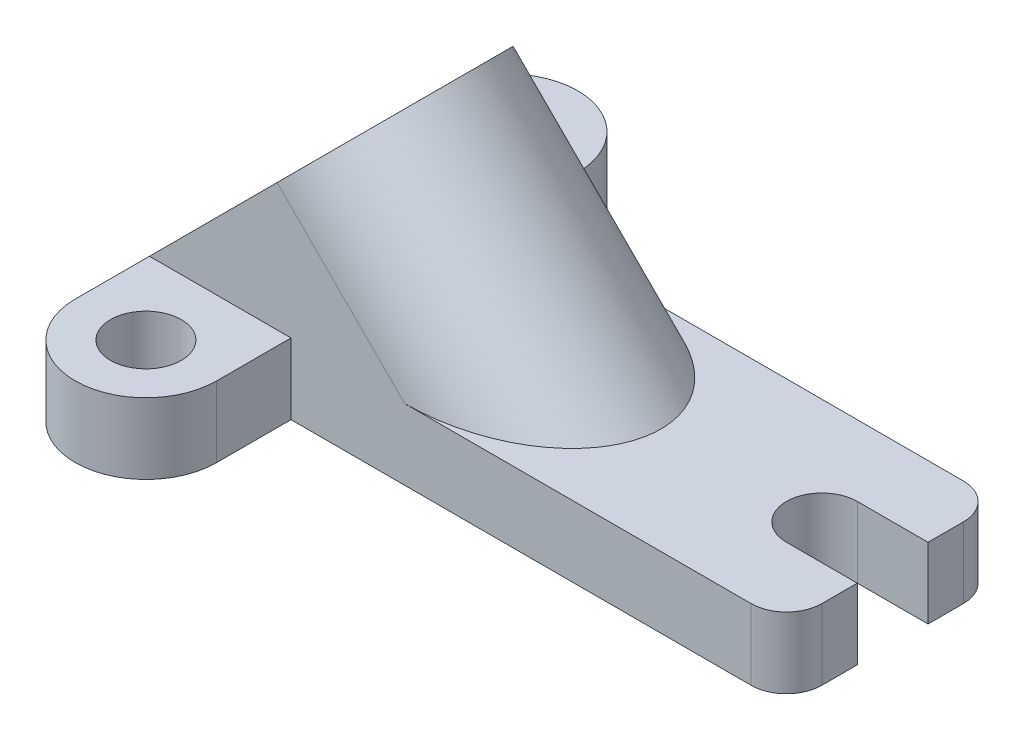
ISO-10303-21;
HEADER;
FILE_DESCRIPTION(('STEP AP214'),'2;1');
FILE_NAME('part.step','',(''),(''),'','','');
FILE_SCHEMA(('AUTOMOTIVE_DESIGN { 1 0 10303 214 1 1 1 1 }'));
ENDSEC;
DATA;
#1=APPLICATION_CONTEXT('core data for automotive mechanical design processes');
#2=APPLICATION_PROTOCOL_DEFINITION('international standard','automotive_design',2000,#1);
#3=PRODUCT_CONTEXT('',#1,'mechanical');
#4=PRODUCT('Part','Part','',(#3));
#5=PRODUCT_RELATED_PRODUCT_CATEGORY('part','',(#4));
#6=PRODUCT_DEFINITION_FORMATION('','',#4);
#7=PRODUCT_DEFINITION_CONTEXT('part definition',#1,'design');
#8=PRODUCT_DEFINITION('design','',#6,#7);
#9=PRODUCT_DEFINITION_SHAPE('','',#8);
#10=(LENGTH_UNIT() NAMED_UNIT(*) SI_UNIT(.MILLI.,.METRE.));
#11=(NAMED_UNIT(*) PLANE_ANGLE_UNIT() SI_UNIT($,.RADIAN.));
#12=(NAMED_UNIT(*) SI_UNIT($,.STERADIAN.) SOLID_ANGLE_UNIT());
#13=UNCERTAINTY_MEASURE_WITH_UNIT(LENGTH_MEASURE(1.E-05),#10,'distance_accuracy_value','');
#14=(GEOMETRIC_REPRESENTATION_CONTEXT(3) GLOBAL_UNCERTAINTY_ASSIGNED_CONTEXT((#13)) GLOBAL_UNIT_ASSIGNED_CONTEXT((#10,
#11,#12)) REPRESENTATION_CONTEXT('',''));
#15=CARTESIAN_POINT('',(0.,0.,0.));
#16=DIRECTION('',(0.,0.,1.));
#17=DIRECTION('',(1.,0.,0.));
#18=AXIS2_PLACEMENT_3D('',#15,#16,#17);
#19=CARTESIAN_POINT('',(20.,20.,51.));
#20=DIRECTION('',(0.,1.,0.));
#21=DIRECTION('',(0.,0.,1.));
#22=AXIS2_PLACEMENT_3D('',#19,#20,#21);
#23=PLANE('',#22);
#24=CARTESIAN_POINT('',(20.,20.,51.));
#25=DIRECTION('',(0.,1.,0.));
#26=DIRECTION('',(0.,0.,1.));
#27=AXIS2_PLACEMENT_3D('',#24,#25,#26);
#28=CIRCLE('',#27,10.);
#29=CARTESIAN_POINT('',(20.,20.,61.));
#30=VERTEX_POINT('',#29);
#31=EDGE_CURVE('E184',#30,#30,#28,.T.);
#32=ORIENTED_EDGE('',*,*,#31,.F.);
#33=EDGE_LOOP('',(#32));
#34=FACE_BOUND('',#33,.T.);
#35=DIRECTION('',(0.,0.,-1.));
#36=VECTOR('',#35,1.);
#37=CARTESIAN_POINT('',(40.,20.,51.));
#38=LINE('',#37,#36);
#39=CARTESIAN_POINT('',(40.,20.,51.));
#40=VERTEX_POINT('',#39);
#41=CARTESIAN_POINT('',(40.,20.,30.));
#42=VERTEX_POINT('',#41);
#43=EDGE_CURVE('E118',#40,#42,#38,.T.);
#44=ORIENTED_EDGE('',*,*,#43,.T.);
#45=DIRECTION('',(-1.,0.,0.));
#46=VECTOR('',#45,1.);
#47=CARTESIAN_POINT('',(150.739976439355,20.,30.));
#48=LINE('',#47,#46);
#49=CARTESIAN_POINT('',(0.,20.,30.));
#50=VERTEX_POINT('',#49);
#51=EDGE_CURVE('E11',#42,#50,#48,.T.);
#52=ORIENTED_EDGE('',*,*,#51,.T.);
#53=DIRECTION('',(0.,0.,1.));
#54=VECTOR('',#53,1.);
#55=CARTESIAN_POINT('',(0.,20.,-51.));
#56=LINE('',#55,#54);
#57=CARTESIAN_POINT('',(0.,20.,51.));
#58=VERTEX_POINT('',#57);
#59=EDGE_CURVE('E57',#50,#58,#56,.T.);
#60=ORIENTED_EDGE('',*,*,#59,.T.);
#61=CARTESIAN_POINT('',(20.,20.,51.));
#62=DIRECTION('',(0.,1.,0.));
#63=DIRECTION('',(0.,0.,1.));
#64=AXIS2_PLACEMENT_3D('',#61,#62,#63);
#65=CIRCLE('',#64,20.);
#66=EDGE_CURVE('E208',#58,#40,#65,.T.);
#67=ORIENTED_EDGE('',*,*,#66,.T.);
#68=EDGE_LOOP('',(#44,#52,#60,#67));
#69=FACE_BOUND('',#68,.T.);
#70=ADVANCED_FACE('F33',(#34,#69),#23,.T.);
#71=CARTESIAN_POINT('',(20.,20.,-51.));
#72=DIRECTION('',(0.,1.,0.));
#73=DIRECTION('',(0.,0.,-1.));
#74=AXIS2_PLACEMENT_3D('',#71,#72,#73);
#75=CIRCLE('',#74,10.);
#76=CARTESIAN_POINT('',(20.,20.,-61.));
#77=VERTEX_POINT('',#76);
#78=EDGE_CURVE('E315',#77,#77,#75,.T.);
#79=ORIENTED_EDGE('',*,*,#78,.F.);
#80=EDGE_LOOP('',(#79));
#81=FACE_BOUND('',#80,.T.);
#82=CARTESIAN_POINT('',(0.,20.,-51.));
#83=VERTEX_POINT('',#82);
#84=CARTESIAN_POINT('',(0.,20.,-30.));
#85=VERTEX_POINT('',#84);
#86=EDGE_CURVE('E175',#83,#85,#56,.T.);
#87=ORIENTED_EDGE('',*,*,#86,.T.);
#88=DIRECTION('',(1.,0.,0.));
#89=VECTOR('',#88,1.);
#90=CARTESIAN_POINT('',(114.677530598841,20.,-30.));
#91=LINE('',#90,#89);
#92=CARTESIAN_POINT('',(40.,20.,-30.));
#93=VERTEX_POINT('',#92);
#94=EDGE_CURVE('E156',#85,#93,#91,.T.);
#95=ORIENTED_EDGE('',*,*,#94,.T.);
#96=DIRECTION('',(0.,0.,-1.));
#97=VECTOR('',#96,1.);
#98=CARTESIAN_POINT('',(40.,20.,-51.));
#99=LINE('',#98,#97);
#100=CARTESIAN_POINT('',(40.,20.,-51.));
#101=VERTEX_POINT('',#100);
#102=EDGE_CURVE('E148',#93,#101,#99,.T.);
#103=ORIENTED_EDGE('',*,*,#102,.T.);
#104=CARTESIAN_POINT('',(20.,20.,-51.));
#105=DIRECTION('',(0.,1.,0.));
#106=DIRECTION('',(0.,0.,-1.));
#107=AXIS2_PLACEMENT_3D('',#104,#105,#106);
#108=CIRCLE('',#107,20.);
#109=EDGE_CURVE('E153',#101,#83,#108,.T.);
#110=ORIENTED_EDGE('',*,*,#109,.T.);
#111=EDGE_LOOP('',(#87,#95,#103,#110));
#112=FACE_BOUND('',#111,.T.);
#113=ADVANCED_FACE('F151',(#81,#112),#23,.T.);
#114=DIRECTION('',(-1.,0.,0.));
#115=VECTOR('',#114,1.);
#116=CARTESIAN_POINT('',(40.,20.,-30.));
#117=LINE('',#116,#115);
#118=CARTESIAN_POINT('',(170.,20.,-30.));
#119=VERTEX_POINT('',#118);
#120=CARTESIAN_POINT('',(72.1248916810282,20.,-30.));
#121=VERTEX_POINT('',#120);
#122=EDGE_CURVE('E160',#119,#121,#117,.T.);
#123=ORIENTED_EDGE('',*,*,#122,.T.);
#124=CARTESIAN_POINT('',(72.1248916810282,20.,0.));
#125=DIRECTION('',(0.,1.,0.));
#126=DIRECTION('',(-1.,0.,0.));
#127=AXIS2_PLACEMENT_3D('',#124,#125,#126);
#128=ELLIPSE('',#127,42.4264068711931,30.);
#129=CARTESIAN_POINT('',(72.1248916810282,20.,30.));
#130=VERTEX_POINT('',#129);
#131=EDGE_CURVE('E280',#121,#130,#128,.F.);
#132=ORIENTED_EDGE('',*,*,#131,.T.);
#133=DIRECTION('',(1.,0.,0.));
#134=VECTOR('',#133,1.);
#135=CARTESIAN_POINT('',(40.,20.,30.));
#136=LINE('',#135,#134);
#137=CARTESIAN_POINT('',(170.,20.,30.));
#138=VERTEX_POINT('',#137);
#139=EDGE_CURVE('E261',#130,#138,#136,.T.);
#140=ORIENTED_EDGE('',*,*,#139,.T.);
#141=CARTESIAN_POINT('',(170.,20.,20.));
#142=DIRECTION('',(0.,1.,0.));
#143=DIRECTION('',(0.,0.,1.));
#144=AXIS2_PLACEMENT_3D('',#141,#142,#143);
#145=CIRCLE('',#144,10.);
#146=CARTESIAN_POINT('',(180.,20.,20.));
#147=VERTEX_POINT('',#146);
#148=EDGE_CURVE('E257',#138,#147,#145,.T.);
#149=ORIENTED_EDGE('',*,*,#148,.T.);
#150=DIRECTION('',(0.,0.,-1.));
#151=VECTOR('',#150,1.);
#152=CARTESIAN_POINT('',(180.,20.,20.));
#153=LINE('',#152,#151);
#154=CARTESIAN_POINT('',(180.,20.,9.99999999999999));
#155=VERTEX_POINT('',#154);
#156=EDGE_CURVE('E260',#147,#155,#153,.T.);
#157=ORIENTED_EDGE('',*,*,#156,.T.);
#158=DIRECTION('',(-1.,0.,0.));
#159=VECTOR('',#158,1.);
#160=CARTESIAN_POINT('',(180.,20.,9.99999999999999));
#161=LINE('',#160,#159);
#162=CARTESIAN_POINT('',(160.,20.,10.));
#163=VERTEX_POINT('',#162);
#164=EDGE_CURVE('E263',#155,#163,#161,.T.);
#165=ORIENTED_EDGE('',*,*,#164,.T.);
#166=CARTESIAN_POINT('',(160.,20.,0.));
#167=DIRECTION('',(0.,-1.,0.));
#168=DIRECTION('',(0.,0.,-1.));
#169=AXIS2_PLACEMENT_3D('',#166,#167,#168);
#170=CIRCLE('',#169,10.);
#171=CARTESIAN_POINT('',(160.,20.,-10.));
#172=VERTEX_POINT('',#171);
#173=EDGE_CURVE('E269',#163,#172,#170,.T.);
#174=ORIENTED_EDGE('',*,*,#173,.T.);
#175=DIRECTION('',(1.,0.,0.));
#176=VECTOR('',#175,1.);
#177=CARTESIAN_POINT('',(180.,20.,-9.99999999999999));
#178=LINE('',#177,#176);
#179=CARTESIAN_POINT('',(180.,20.,-9.99999999999999));
#180=VERTEX_POINT('',#179);
#181=EDGE_CURVE('E271',#172,#180,#178,.T.);
#182=ORIENTED_EDGE('',*,*,#181,.T.);
#183=DIRECTION('',(0.,0.,-1.));
#184=VECTOR('',#183,1.);
#185=CARTESIAN_POINT('',(180.,20.,-20.));
#186=LINE('',#185,#184);
#187=CARTESIAN_POINT('',(180.,20.,-20.));
#188=VERTEX_POINT('',#187);
#189=EDGE_CURVE('E273',#180,#188,#186,.T.);
#190=ORIENTED_EDGE('',*,*,#189,.T.);
#191=CARTESIAN_POINT('',(170.,20.,-20.));
#192=DIRECTION('',(0.,1.,0.));
#193=DIRECTION('',(0.,0.,-1.));
#194=AXIS2_PLACEMENT_3D('',#191,#192,#193);
#195=CIRCLE('',#194,10.);
#196=EDGE_CURVE('E275',#188,#119,#195,.T.);
#197=ORIENTED_EDGE('',*,*,#196,.T.);
#198=EDGE_LOOP('',(#123,#132,#140,#149,#157,#165,#174,#182,#190,#197));
#199=FACE_BOUND('',#198,.T.);
#200=ADVANCED_FACE('F279',(#199),#23,.T.);
#201=CARTESIAN_POINT('',(20.,0.,51.));
#202=DIRECTION('',(0.,1.,0.));
#203=DIRECTION('',(0.,0.,1.));
#204=AXIS2_PLACEMENT_3D('',#201,#202,#203);
#205=PLANE('',#204);
#206=CARTESIAN_POINT('',(92.1248916810284,0.,0.));
#207=DIRECTION('',(0.,1.,0.));
#208=DIRECTION('',(-1.,0.,0.));
#209=AXIS2_PLACEMENT_3D('',#206,#207,#208);
#210=ELLIPSE('',#209,21.2132034355965,15.);
#211=CARTESIAN_POINT('',(70.9116882454319,0.,0.));
#212=VERTEX_POINT('',#211);
#213=EDGE_CURVE('E308',#212,#212,#210,.F.);
#214=ORIENTED_EDGE('',*,*,#213,.F.);
#215=EDGE_LOOP('',(#214));
#216=FACE_BOUND('',#215,.T.);
#217=CARTESIAN_POINT('',(20.,0.,51.));
#218=DIRECTION('',(0.,1.,0.));
#219=DIRECTION('',(0.,0.,1.));
#220=AXIS2_PLACEMENT_3D('',#217,#218,#219);
#221=CIRCLE('',#220,20.);
#222=CARTESIAN_POINT('',(0.,0.,51.));
#223=VERTEX_POINT('',#222);
#224=CARTESIAN_POINT('',(40.,0.,51.));
#225=VERTEX_POINT('',#224);
#226=EDGE_CURVE('E180',#223,#225,#221,.T.);
#227=ORIENTED_EDGE('',*,*,#226,.F.);
#228=DIRECTION('',(0.,0.,1.));
#229=VECTOR('',#228,1.);
#230=CARTESIAN_POINT('',(0.,0.,-51.));
#231=LINE('',#230,#229);
#232=CARTESIAN_POINT('',(0.,0.,-51.));
#233=VERTEX_POINT('',#232);
#234=EDGE_CURVE('E109',#233,#223,#231,.T.);
#235=ORIENTED_EDGE('',*,*,#234,.F.);
#236=CARTESIAN_POINT('',(20.,0.,-51.));
#237=DIRECTION('',(0.,1.,0.));
#238=DIRECTION('',(0.,0.,-1.));
#239=AXIS2_PLACEMENT_3D('',#236,#237,#238);
#240=CIRCLE('',#239,20.);
#241=CARTESIAN_POINT('',(40.,0.,-51.));
#242=VERTEX_POINT('',#241);
#243=EDGE_CURVE('E205',#242,#233,#240,.T.);
#244=ORIENTED_EDGE('',*,*,#243,.F.);
#245=DIRECTION('',(0.,0.,-1.));
#246=VECTOR('',#245,1.);
#247=CARTESIAN_POINT('',(40.,0.,-51.));
#248=LINE('',#247,#246);
#249=CARTESIAN_POINT('',(40.,0.,-30.));
#250=VERTEX_POINT('',#249);
#251=EDGE_CURVE('E166',#250,#242,#248,.T.);
#252=ORIENTED_EDGE('',*,*,#251,.F.);
#253=DIRECTION('',(-1.,0.,0.));
#254=VECTOR('',#253,1.);
#255=CARTESIAN_POINT('',(40.,0.,-30.));
#256=LINE('',#255,#254);
#257=CARTESIAN_POINT('',(170.,0.,-30.));
#258=VERTEX_POINT('',#257);
#259=EDGE_CURVE('E202',#258,#250,#256,.T.);
#260=ORIENTED_EDGE('',*,*,#259,.F.);
#261=CARTESIAN_POINT('',(170.,0.,-20.));
#262=DIRECTION('',(0.,1.,0.));
#263=DIRECTION('',(0.,0.,-1.));
#264=AXIS2_PLACEMENT_3D('',#261,#262,#263);
#265=CIRCLE('',#264,10.);
#266=CARTESIAN_POINT('',(180.,0.,-20.));
#267=VERTEX_POINT('',#266);
#268=EDGE_CURVE('E200',#267,#258,#265,.T.);
#269=ORIENTED_EDGE('',*,*,#268,.F.);
#270=DIRECTION('',(0.,0.,-1.));
#271=VECTOR('',#270,1.);
#272=CARTESIAN_POINT('',(180.,0.,-20.));
#273=LINE('',#272,#271);
#274=CARTESIAN_POINT('',(180.,0.,-9.99999999999999));
#275=VERTEX_POINT('',#274);
#276=EDGE_CURVE('E198',#275,#267,#273,.T.);
#277=ORIENTED_EDGE('',*,*,#276,.F.);
#278=DIRECTION('',(1.,0.,0.));
#279=VECTOR('',#278,1.);
#280=CARTESIAN_POINT('',(180.,0.,-9.99999999999999));
#281=LINE('',#280,#279);
#282=CARTESIAN_POINT('',(160.,0.,-10.));
#283=VERTEX_POINT('',#282);
#284=EDGE_CURVE('E196',#283,#275,#281,.T.);
#285=ORIENTED_EDGE('',*,*,#284,.F.);
#286=CARTESIAN_POINT('',(160.,0.,0.));
#287=DIRECTION('',(0.,-1.,0.));
#288=DIRECTION('',(0.,0.,-1.));
#289=AXIS2_PLACEMENT_3D('',#286,#287,#288);
#290=CIRCLE('',#289,10.);
#291=CARTESIAN_POINT('',(160.,0.,10.));
#292=VERTEX_POINT('',#291);
#293=EDGE_CURVE('E194',#292,#283,#290,.T.);
#294=ORIENTED_EDGE('',*,*,#293,.F.);
#295=DIRECTION('',(-1.,0.,0.));
#296=VECTOR('',#295,1.);
#297=CARTESIAN_POINT('',(180.,0.,9.99999999999999));
#298=LINE('',#297,#296);
#299=CARTESIAN_POINT('',(180.,0.,9.99999999999999));
#300=VERTEX_POINT('',#299);
#301=EDGE_CURVE('E192',#300,#292,#298,.T.);
#302=ORIENTED_EDGE('',*,*,#301,.F.);
#303=DIRECTION('',(0.,0.,-1.));
#304=VECTOR('',#303,1.);
#305=CARTESIAN_POINT('',(180.,0.,20.));
#306=LINE('',#305,#304);
#307=CARTESIAN_POINT('',(180.,0.,20.));
#308=VERTEX_POINT('',#307);
#309=EDGE_CURVE('E190',#308,#300,#306,.T.);
#310=ORIENTED_EDGE('',*,*,#309,.F.);
#311=CARTESIAN_POINT('',(170.,0.,20.));
#312=DIRECTION('',(0.,1.,0.));
#313=DIRECTION('',(0.,0.,1.));
#314=AXIS2_PLACEMENT_3D('',#311,#312,#313);
#315=CIRCLE('',#314,10.);
#316=CARTESIAN_POINT('',(170.,0.,30.));
#317=VERTEX_POINT('',#316);
#318=EDGE_CURVE('E188',#317,#308,#315,.T.);
#319=ORIENTED_EDGE('',*,*,#318,.F.);
#320=DIRECTION('',(1.,0.,0.));
#321=VECTOR('',#320,1.);
#322=CARTESIAN_POINT('',(40.,0.,30.));
#323=LINE('',#322,#321);
#324=CARTESIAN_POINT('',(40.,0.,30.));
#325=VERTEX_POINT('',#324);
#326=EDGE_CURVE('E186',#325,#317,#323,.T.);
#327=ORIENTED_EDGE('',*,*,#326,.F.);
#328=DIRECTION('',(0.,0.,-1.));
#329=VECTOR('',#328,1.);
#330=CARTESIAN_POINT('',(40.,0.,51.));
#331=LINE('',#330,#329);
#332=EDGE_CURVE('E183',#225,#325,#331,.T.);
#333=ORIENTED_EDGE('',*,*,#332,.F.);
#334=EDGE_LOOP('',(#227,#235,#244,#252,#260,#269,#277,#285,#294,#302,#310,#319,#327,#333));
#335=FACE_BOUND('',#334,.T.);
#336=CARTESIAN_POINT('',(20.,0.,51.));
#337=DIRECTION('',(0.,1.,0.));
#338=DIRECTION('',(0.,0.,1.));
#339=AXIS2_PLACEMENT_3D('',#336,#337,#338);
#340=CIRCLE('',#339,10.);
#341=CARTESIAN_POINT('',(20.,0.,61.));
#342=VERTEX_POINT('',#341);
#343=EDGE_CURVE('E318',#342,#342,#340,.T.);
#344=ORIENTED_EDGE('',*,*,#343,.T.);
#345=EDGE_LOOP('',(#344));
#346=FACE_BOUND('',#345,.T.);
#347=CARTESIAN_POINT('',(20.,0.,-51.));
#348=DIRECTION('',(0.,1.,0.));
#349=DIRECTION('',(0.,0.,-1.));
#350=AXIS2_PLACEMENT_3D('',#347,#348,#349);
#351=CIRCLE('',#350,10.);
#352=CARTESIAN_POINT('',(20.,0.,-61.));
#353=VERTEX_POINT('',#352);
#354=EDGE_CURVE('E300',#353,#353,#351,.T.);
#355=ORIENTED_EDGE('',*,*,#354,.T.);
#356=EDGE_LOOP('',(#355));
#357=FACE_BOUND('',#356,.T.);
#358=ADVANCED_FACE('F246',(#216,#335,#346,#357),#205,.F.);
#359=CARTESIAN_POINT('',(20.,20.,51.));
#360=DIRECTION('',(0.,-1.,0.));
#361=DIRECTION('',(0.,0.,-1.));
#362=AXIS2_PLACEMENT_3D('',#359,#360,#361);
#363=CYLINDRICAL_SURFACE('',#362,20.);
#364=ORIENTED_EDGE('',*,*,#226,.T.);
#365=DIRECTION('',(0.,-1.,0.));
#366=VECTOR('',#365,1.);
#367=CARTESIAN_POINT('',(40.,20.,51.));
#368=LINE('',#367,#366);
#369=EDGE_CURVE('E37',#40,#225,#368,.T.);
#370=ORIENTED_EDGE('',*,*,#369,.F.);
#371=ORIENTED_EDGE('',*,*,#66,.F.);
#372=DIRECTION('',(0.,-1.,0.));
#373=VECTOR('',#372,1.);
#374=CARTESIAN_POINT('',(0.,20.,51.));
#375=LINE('',#374,#373);
#376=EDGE_CURVE('E179',#58,#223,#375,.T.);
#377=ORIENTED_EDGE('',*,*,#376,.T.);
#378=EDGE_LOOP('',(#364,#370,#371,#377));
#379=FACE_BOUND('',#378,.T.);
#380=ADVANCED_FACE('F35',(#379),#363,.T.);
#381=CARTESIAN_POINT('',(40.,20.,51.));
#382=DIRECTION('',(-1.,0.,0.));
#383=DIRECTION('',(0.,0.,1.));
#384=AXIS2_PLACEMENT_3D('',#381,#382,#383);
#385=PLANE('',#384);
#386=ORIENTED_EDGE('',*,*,#332,.T.);
#387=DIRECTION('',(0.,-1.,0.));
#388=VECTOR('',#387,1.);
#389=CARTESIAN_POINT('',(40.,20.,30.));
#390=LINE('',#389,#388);
#391=EDGE_CURVE('E235',#42,#325,#390,.T.);
#392=ORIENTED_EDGE('',*,*,#391,.F.);
#393=ORIENTED_EDGE('',*,*,#43,.F.);
#394=ORIENTED_EDGE('',*,*,#369,.T.);
#395=EDGE_LOOP('',(#386,#392,#393,#394));
#396=FACE_BOUND('',#395,.T.);
#397=ADVANCED_FACE('F241',(#396),#385,.F.);
#398=CARTESIAN_POINT('',(40.,20.,30.));
#399=DIRECTION('',(0.,0.,-1.));
#400=DIRECTION('',(-1.,0.,0.));
#401=AXIS2_PLACEMENT_3D('',#398,#399,#400);
#402=PLANE('',#401);
#403=ORIENTED_EDGE('',*,*,#326,.T.);
#404=DIRECTION('',(0.,-1.,0.));
#405=VECTOR('',#404,1.);
#406=CARTESIAN_POINT('',(170.,20.,30.));
#407=LINE('',#406,#405);
#408=EDGE_CURVE('E233',#138,#317,#407,.T.);
#409=ORIENTED_EDGE('',*,*,#408,.F.);
#410=ORIENTED_EDGE('',*,*,#139,.F.);
#411=DIRECTION('',(-0.707106781186551,0.707106781186544,0.));
#412=VECTOR('',#411,1.);
#413=CARTESIAN_POINT('',(150.739976439355,-58.6150847583255,30.));
#414=LINE('',#413,#412);
#415=CARTESIAN_POINT('',(36.0624458405137,56.0624458405141,30.));
#416=VERTEX_POINT('',#415);
#417=EDGE_CURVE('E49',#130,#416,#414,.T.);
#418=ORIENTED_EDGE('',*,*,#417,.T.);
#419=DIRECTION('',(0.707106781186544,0.707106781186551,0.));
#420=VECTOR('',#419,1.);
#421=CARTESIAN_POINT('',(36.0624458405137,56.0624458405141,30.));
#422=LINE('',#421,#420);
#423=EDGE_CURVE('E304',#50,#416,#422,.T.);
#424=ORIENTED_EDGE('',*,*,#423,.F.);
#425=ORIENTED_EDGE('',*,*,#51,.F.);
#426=ORIENTED_EDGE('',*,*,#391,.T.);
#427=EDGE_LOOP('',(#403,#409,#410,#418,#424,#425,#426));
#428=FACE_BOUND('',#427,.T.);
#429=ADVANCED_FACE('F251',(#428),#402,.F.);
#430=CARTESIAN_POINT('',(170.,20.,20.));
#431=DIRECTION('',(0.,-1.,0.));
#432=DIRECTION('',(0.,0.,-1.));
#433=AXIS2_PLACEMENT_3D('',#430,#431,#432);
#434=CYLINDRICAL_SURFACE('',#433,10.);
#435=ORIENTED_EDGE('',*,*,#318,.T.);
#436=DIRECTION('',(0.,-1.,0.));
#437=VECTOR('',#436,1.);
#438=CARTESIAN_POINT('',(180.,20.,20.));
#439=LINE('',#438,#437);
#440=EDGE_CURVE('E230',#147,#308,#439,.T.);
#441=ORIENTED_EDGE('',*,*,#440,.F.);
#442=ORIENTED_EDGE('',*,*,#148,.F.);
#443=ORIENTED_EDGE('',*,*,#408,.T.);
#444=EDGE_LOOP('',(#435,#441,#442,#443));
#445=FACE_BOUND('',#444,.T.);
#446=ADVANCED_FACE('F255',(#445),#434,.T.);
#447=CARTESIAN_POINT('',(180.,20.,20.));
#448=DIRECTION('',(-1.,0.,0.));
#449=DIRECTION('',(0.,0.,1.));
#450=AXIS2_PLACEMENT_3D('',#447,#448,#449);
#451=PLANE('',#450);
#452=ORIENTED_EDGE('',*,*,#309,.T.);
#453=DIRECTION('',(0.,-1.,0.));
#454=VECTOR('',#453,1.);
#455=CARTESIAN_POINT('',(180.,20.,9.99999999999999));
#456=LINE('',#455,#454);
#457=EDGE_CURVE('E227',#155,#300,#456,.T.);
#458=ORIENTED_EDGE('',*,*,#457,.F.);
#459=ORIENTED_EDGE('',*,*,#156,.F.);
#460=ORIENTED_EDGE('',*,*,#440,.T.);
#461=EDGE_LOOP('',(#452,#458,#459,#460));
#462=FACE_BOUND('',#461,.T.);
#463=ADVANCED_FACE('F503',(#462),#451,.F.);
#464=CARTESIAN_POINT('',(180.,20.,9.99999999999999));
#465=DIRECTION('',(0.,0.,1.));
#466=DIRECTION('',(1.,0.,0.));
#467=AXIS2_PLACEMENT_3D('',#464,#465,#466);
#468=PLANE('',#467);
#469=ORIENTED_EDGE('',*,*,#301,.T.);
#470=DIRECTION('',(0.,-1.,0.));
#471=VECTOR('',#470,1.);
#472=CARTESIAN_POINT('',(160.,20.,10.));
#473=LINE('',#472,#471);
#474=EDGE_CURVE('E224',#163,#292,#473,.T.);
#475=ORIENTED_EDGE('',*,*,#474,.F.);
#476=ORIENTED_EDGE('',*,*,#164,.F.);
#477=ORIENTED_EDGE('',*,*,#457,.T.);
#478=EDGE_LOOP('',(#469,#475,#476,#477));
#479=FACE_BOUND('',#478,.T.);
#480=ADVANCED_FACE('F495',(#479),#468,.F.);
#481=CARTESIAN_POINT('',(160.,20.,0.));
#482=DIRECTION('',(0.,-1.,0.));
#483=DIRECTION('',(0.,0.,-1.));
#484=AXIS2_PLACEMENT_3D('',#481,#482,#483);
#485=CYLINDRICAL_SURFACE('',#484,10.);
#486=ORIENTED_EDGE('',*,*,#293,.T.);
#487=DIRECTION('',(0.,-1.,0.));
#488=VECTOR('',#487,1.);
#489=CARTESIAN_POINT('',(160.,20.,-10.));
#490=LINE('',#489,#488);
#491=EDGE_CURVE('E221',#172,#283,#490,.T.);
#492=ORIENTED_EDGE('',*,*,#491,.F.);
#493=ORIENTED_EDGE('',*,*,#173,.F.);
#494=ORIENTED_EDGE('',*,*,#474,.T.);
#495=EDGE_LOOP('',(#486,#492,#493,#494));
#496=FACE_BOUND('',#495,.T.);
#497=ADVANCED_FACE('F487',(#496),#485,.F.);
#498=CARTESIAN_POINT('',(180.,20.,-9.99999999999999));
#499=DIRECTION('',(0.,0.,-1.));
#500=DIRECTION('',(-1.,0.,0.));
#501=AXIS2_PLACEMENT_3D('',#498,#499,#500);
#502=PLANE('',#501);
#503=ORIENTED_EDGE('',*,*,#284,.T.);
#504=DIRECTION('',(0.,-1.,0.));
#505=VECTOR('',#504,1.);
#506=CARTESIAN_POINT('',(180.,20.,-9.99999999999999));
#507=LINE('',#506,#505);
#508=EDGE_CURVE('E218',#180,#275,#507,.T.);
#509=ORIENTED_EDGE('',*,*,#508,.F.);
#510=ORIENTED_EDGE('',*,*,#181,.F.);
#511=ORIENTED_EDGE('',*,*,#491,.T.);
#512=EDGE_LOOP('',(#503,#509,#510,#511));
#513=FACE_BOUND('',#512,.T.);
#514=ADVANCED_FACE('F479',(#513),#502,.F.);
#515=CARTESIAN_POINT('',(180.,20.,-20.));
#516=DIRECTION('',(-1.,0.,0.));
#517=DIRECTION('',(0.,0.,1.));
#518=AXIS2_PLACEMENT_3D('',#515,#516,#517);
#519=PLANE('',#518);
#520=ORIENTED_EDGE('',*,*,#276,.T.);
#521=DIRECTION('',(0.,-1.,0.));
#522=VECTOR('',#521,1.);
#523=CARTESIAN_POINT('',(180.,20.,-20.));
#524=LINE('',#523,#522);
#525=EDGE_CURVE('E215',#188,#267,#524,.T.);
#526=ORIENTED_EDGE('',*,*,#525,.F.);
#527=ORIENTED_EDGE('',*,*,#189,.F.);
#528=ORIENTED_EDGE('',*,*,#508,.T.);
#529=EDGE_LOOP('',(#520,#526,#527,#528));
#530=FACE_BOUND('',#529,.T.);
#531=ADVANCED_FACE('F472',(#530),#519,.F.);
#532=CARTESIAN_POINT('',(170.,20.,-20.));
#533=DIRECTION('',(0.,-1.,0.));
#534=DIRECTION('',(0.,0.,-1.));
#535=AXIS2_PLACEMENT_3D('',#532,#533,#534);
#536=CYLINDRICAL_SURFACE('',#535,10.);
#537=ORIENTED_EDGE('',*,*,#268,.T.);
#538=DIRECTION('',(0.,-1.,0.));
#539=VECTOR('',#538,1.);
#540=CARTESIAN_POINT('',(170.,20.,-30.));
#541=LINE('',#540,#539);
#542=EDGE_CURVE('E212',#119,#258,#541,.T.);
#543=ORIENTED_EDGE('',*,*,#542,.F.);
#544=ORIENTED_EDGE('',*,*,#196,.F.);
#545=ORIENTED_EDGE('',*,*,#525,.T.);
#546=EDGE_LOOP('',(#537,#543,#544,#545));
#547=FACE_BOUND('',#546,.T.);
#548=ADVANCED_FACE('F415',(#547),#536,.T.);
#549=CARTESIAN_POINT('',(40.,20.,-30.));
#550=DIRECTION('',(0.,0.,1.));
#551=DIRECTION('',(1.,0.,0.));
#552=AXIS2_PLACEMENT_3D('',#549,#550,#551);
#553=PLANE('',#552);
#554=ORIENTED_EDGE('',*,*,#259,.T.);
#555=DIRECTION('',(0.,-1.,0.));
#556=VECTOR('',#555,1.);
#557=CARTESIAN_POINT('',(40.,20.,-30.));
#558=LINE('',#557,#556);
#559=EDGE_CURVE('E169',#93,#250,#558,.T.);
#560=ORIENTED_EDGE('',*,*,#559,.F.);
#561=ORIENTED_EDGE('',*,*,#94,.F.);
#562=DIRECTION('',(-0.707106781186544,-0.707106781186551,0.));
#563=VECTOR('',#562,1.);
#564=CARTESIAN_POINT('',(0.,20.,-30.));
#565=LINE('',#564,#563);
#566=CARTESIAN_POINT('',(36.0624458405137,56.0624458405141,-30.));
#567=VERTEX_POINT('',#566);
#568=EDGE_CURVE('E295',#567,#85,#565,.T.);
#569=ORIENTED_EDGE('',*,*,#568,.F.);
#570=DIRECTION('',(-0.707106781186551,0.707106781186544,0.));
#571=VECTOR('',#570,1.);
#572=CARTESIAN_POINT('',(150.739976439355,-58.6150847583255,-30.));
#573=LINE('',#572,#571);
#574=EDGE_CURVE('E292',#121,#567,#573,.T.);
#575=ORIENTED_EDGE('',*,*,#574,.F.);
#576=ORIENTED_EDGE('',*,*,#122,.F.);
#577=ORIENTED_EDGE('',*,*,#542,.T.);
#578=EDGE_LOOP('',(#554,#560,#561,#569,#575,#576,#577));
#579=FACE_BOUND('',#578,.T.);
#580=ADVANCED_FACE('F288',(#579),#553,.F.);
#581=CARTESIAN_POINT('',(40.,20.,-51.));
#582=DIRECTION('',(-1.,0.,0.));
#583=DIRECTION('',(0.,0.,1.));
#584=AXIS2_PLACEMENT_3D('',#581,#582,#583);
#585=PLANE('',#584);
#586=ORIENTED_EDGE('',*,*,#251,.T.);
#587=DIRECTION('',(0.,-1.,0.));
#588=VECTOR('',#587,1.);
#589=CARTESIAN_POINT('',(40.,20.,-51.));
#590=LINE('',#589,#588);
#591=EDGE_CURVE('E163',#101,#242,#590,.T.);
#592=ORIENTED_EDGE('',*,*,#591,.F.);
#593=ORIENTED_EDGE('',*,*,#102,.F.);
#594=ORIENTED_EDGE('',*,*,#559,.T.);
#595=EDGE_LOOP('',(#586,#592,#593,#594));
#596=FACE_BOUND('',#595,.T.);
#597=ADVANCED_FACE('F164',(#596),#585,.F.);
#598=CARTESIAN_POINT('',(20.,20.,-51.));
#599=DIRECTION('',(0.,-1.,0.));
#600=DIRECTION('',(0.,0.,-1.));
#601=AXIS2_PLACEMENT_3D('',#598,#599,#600);
#602=CYLINDRICAL_SURFACE('',#601,20.);
#603=ORIENTED_EDGE('',*,*,#243,.T.);
#604=DIRECTION('',(0.,-1.,0.));
#605=VECTOR('',#604,1.);
#606=CARTESIAN_POINT('',(0.,20.,-51.));
#607=LINE('',#606,#605);
#608=EDGE_CURVE('E170',#83,#233,#607,.T.);
#609=ORIENTED_EDGE('',*,*,#608,.F.);
#610=ORIENTED_EDGE('',*,*,#109,.F.);
#611=ORIENTED_EDGE('',*,*,#591,.T.);
#612=EDGE_LOOP('',(#603,#609,#610,#611));
#613=FACE_BOUND('',#612,.T.);
#614=ADVANCED_FACE('F172',(#613),#602,.T.);
#615=CARTESIAN_POINT('',(0.,20.,-51.));
#616=DIRECTION('',(1.,0.,0.));
#617=DIRECTION('',(0.,0.,-1.));
#618=AXIS2_PLACEMENT_3D('',#615,#616,#617);
#619=PLANE('',#618);
#620=ORIENTED_EDGE('',*,*,#234,.T.);
#621=ORIENTED_EDGE('',*,*,#376,.F.);
#622=ORIENTED_EDGE('',*,*,#59,.F.);
#623=DIRECTION('',(0.,0.,1.));
#624=VECTOR('',#623,1.);
#625=CARTESIAN_POINT('',(0.,20.,30.));
#626=LINE('',#625,#624);
#627=EDGE_CURVE('E311',#85,#50,#626,.T.);
#628=ORIENTED_EDGE('',*,*,#627,.F.);
#629=ORIENTED_EDGE('',*,*,#86,.F.);
#630=ORIENTED_EDGE('',*,*,#608,.T.);
#631=EDGE_LOOP('',(#620,#621,#622,#628,#629,#630));
#632=FACE_BOUND('',#631,.T.);
#633=ADVANCED_FACE('F335',(#632),#619,.F.);
#634=CARTESIAN_POINT('',(20.,20.,51.));
#635=DIRECTION('',(0.,-1.,0.));
#636=DIRECTION('',(0.,0.,-1.));
#637=AXIS2_PLACEMENT_3D('',#634,#635,#636);
#638=CYLINDRICAL_SURFACE('',#637,10.);
#639=ORIENTED_EDGE('',*,*,#31,.T.);
#640=EDGE_LOOP('',(#639));
#641=FACE_BOUND('',#640,.T.);
#642=ORIENTED_EDGE('',*,*,#343,.F.);
#643=EDGE_LOOP('',(#642));
#644=FACE_BOUND('',#643,.T.);
#645=ADVANCED_FACE('F337',(#641,#644),#638,.F.);
#646=CARTESIAN_POINT('',(20.,20.,-51.));
#647=DIRECTION('',(0.,-1.,0.));
#648=DIRECTION('',(0.,0.,-1.));
#649=AXIS2_PLACEMENT_3D('',#646,#647,#648);
#650=CYLINDRICAL_SURFACE('',#649,10.);
#651=ORIENTED_EDGE('',*,*,#78,.T.);
#652=EDGE_LOOP('',(#651));
#653=FACE_BOUND('',#652,.T.);
#654=ORIENTED_EDGE('',*,*,#354,.F.);
#655=EDGE_LOOP('',(#654));
#656=FACE_BOUND('',#655,.T.);
#657=ADVANCED_FACE('F343',(#653,#656),#650,.F.);
#658=CARTESIAN_POINT('',(36.0624458405137,56.0624458405141,0.));
#659=DIRECTION('',(0.707106781186551,-0.707106781186544,0.));
#660=DIRECTION('',(0.707106781186544,0.707106781186551,0.));
#661=AXIS2_PLACEMENT_3D('',#658,#659,#660);
#662=PLANE('',#661);
#663=CARTESIAN_POINT('',(36.0624458405137,56.0624458405141,0.));
#664=DIRECTION('',(-0.707106781186551,0.707106781186544,0.));
#665=DIRECTION('',(-0.707106781186544,-0.707106781186551,0.));
#666=AXIS2_PLACEMENT_3D('',#663,#664,#665);
#667=CIRCLE('',#666,15.);
#668=CARTESIAN_POINT('',(25.4558441227156,45.4558441227158,0.));
#669=VERTEX_POINT('',#668);
#670=EDGE_CURVE('E367',#669,#669,#667,.T.);
#671=ORIENTED_EDGE('',*,*,#670,.F.);
#672=EDGE_LOOP('',(#671));
#673=FACE_BOUND('',#672,.T.);
#674=ORIENTED_EDGE('',*,*,#423,.T.);
#675=CARTESIAN_POINT('',(36.0624458405137,56.0624458405141,0.));
#676=DIRECTION('',(-0.707106781186551,0.707106781186544,0.));
#677=DIRECTION('',(0.707106781186544,0.707106781186551,0.));
#678=AXIS2_PLACEMENT_3D('',#675,#676,#677);
#679=CIRCLE('',#678,30.);
#680=EDGE_CURVE('E307',#416,#567,#679,.T.);
#681=ORIENTED_EDGE('',*,*,#680,.T.);
#682=ORIENTED_EDGE('',*,*,#568,.T.);
#683=ORIENTED_EDGE('',*,*,#627,.T.);
#684=EDGE_LOOP('',(#674,#681,#682,#683));
#685=FACE_BOUND('',#684,.T.);
#686=ADVANCED_FACE('F333',(#673,#685),#662,.F.);
#687=CARTESIAN_POINT('',(150.739976439355,-58.6150847583255,0.));
#688=DIRECTION('',(-0.707106781186551,0.707106781186544,0.));
#689=DIRECTION('',(-0.707106781186544,-0.707106781186551,0.));
#690=AXIS2_PLACEMENT_3D('',#687,#688,#689);
#691=CYLINDRICAL_SURFACE('',#690,30.);
#692=ORIENTED_EDGE('',*,*,#131,.F.);
#693=ORIENTED_EDGE('',*,*,#574,.T.);
#694=ORIENTED_EDGE('',*,*,#680,.F.);
#695=ORIENTED_EDGE('',*,*,#417,.F.);
#696=EDGE_LOOP('',(#692,#693,#694,#695));
#697=FACE_BOUND('',#696,.T.);
#698=ADVANCED_FACE('F298',(#697),#691,.T.);
#699=CARTESIAN_POINT('',(128.338095116625,-36.2132034355964,0.));
#700=DIRECTION('',(-0.707106781186551,0.707106781186544,0.));
#701=DIRECTION('',(-0.707106781186544,-0.707106781186551,0.));
#702=AXIS2_PLACEMENT_3D('',#699,#700,#701);
#703=CYLINDRICAL_SURFACE('',#702,15.);
#704=ORIENTED_EDGE('',*,*,#213,.T.);
#705=EDGE_LOOP('',(#704));
#706=FACE_BOUND('',#705,.T.);
#707=ORIENTED_EDGE('',*,*,#670,.T.);
#708=EDGE_LOOP('',(#707));
#709=FACE_BOUND('',#708,.T.);
#710=ADVANCED_FACE('F372',(#706,#709),#703,.F.);
#711=CLOSED_SHELL('',(#70,#113,#200,#358,#380,#397,#429,#446,#463,#480,#497,#514,#531,#548,#580,
#597,#614,#633,#645,#657,#686,#698,#710));
#712=MANIFOLD_SOLID_BREP('B2',#711);
#713=ADVANCED_BREP_SHAPE_REPRESENTATION('',(#18,#712),#14);
#714=SHAPE_DEFINITION_REPRESENTATION(#9,#713);
ENDSEC;
END-ISO-10303-21;
